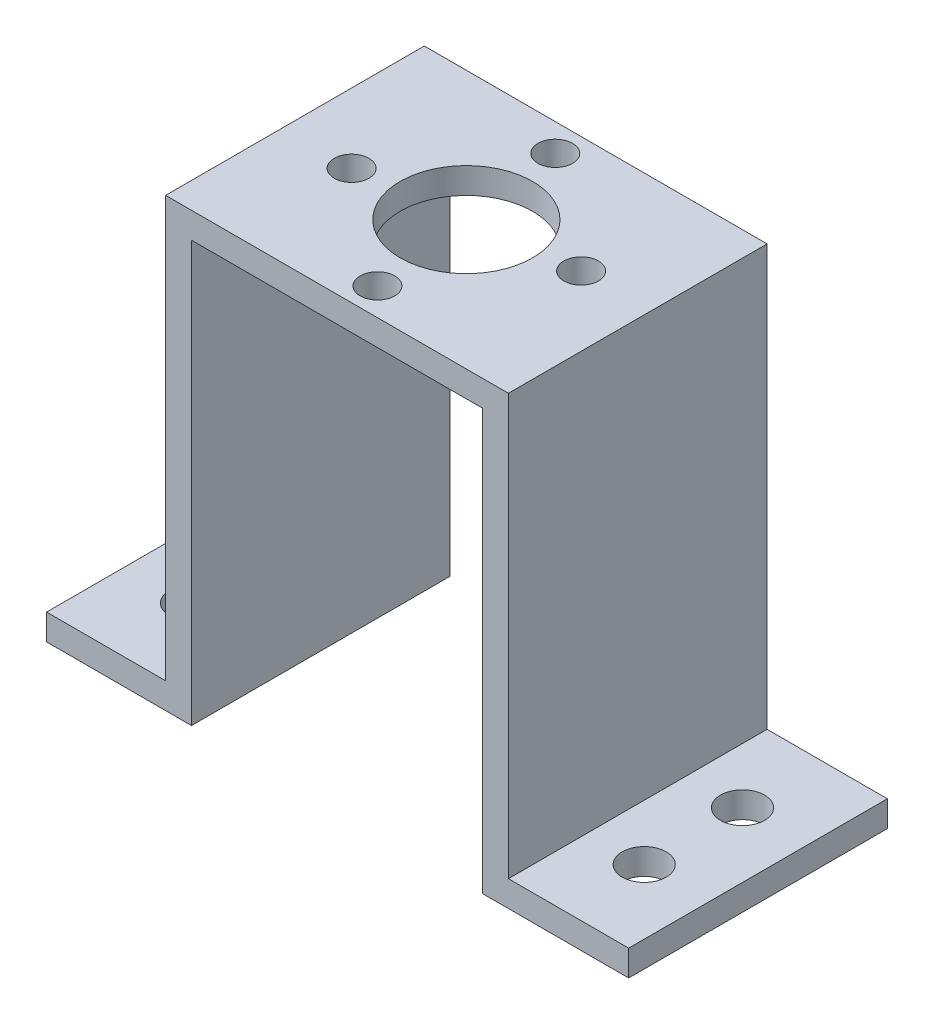
ISO-10303-21;
HEADER;
FILE_DESCRIPTION(('STEP AP214'),'2;1');
FILE_NAME('part.step','',(''),(''),'','','');
FILE_SCHEMA(('AUTOMOTIVE_DESIGN { 1 0 10303 214 1 1 1 1 }'));
ENDSEC;
DATA;
#1=APPLICATION_CONTEXT('core data for automotive mechanical design processes');
#2=APPLICATION_PROTOCOL_DEFINITION('international standard','automotive_design',2000,#1);
#3=PRODUCT_CONTEXT('',#1,'mechanical');
#4=PRODUCT('Part','Part','',(#3));
#5=PRODUCT_RELATED_PRODUCT_CATEGORY('part','',(#4));
#6=PRODUCT_DEFINITION_FORMATION('','',#4);
#7=PRODUCT_DEFINITION_CONTEXT('part definition',#1,'design');
#8=PRODUCT_DEFINITION('design','',#6,#7);
#9=PRODUCT_DEFINITION_SHAPE('','',#8);
#10=(LENGTH_UNIT() NAMED_UNIT(*) SI_UNIT(.MILLI.,.METRE.));
#11=(NAMED_UNIT(*) PLANE_ANGLE_UNIT() SI_UNIT($,.RADIAN.));
#12=(NAMED_UNIT(*) SI_UNIT($,.STERADIAN.) SOLID_ANGLE_UNIT());
#13=UNCERTAINTY_MEASURE_WITH_UNIT(LENGTH_MEASURE(1.E-05),#10,'distance_accuracy_value','');
#14=(GEOMETRIC_REPRESENTATION_CONTEXT(3) GLOBAL_UNCERTAINTY_ASSIGNED_CONTEXT((#13)) GLOBAL_UNIT_ASSIGNED_CONTEXT((#10,
#11,#12)) REPRESENTATION_CONTEXT('',''));
#15=CARTESIAN_POINT('',(0.,0.,0.));
#16=DIRECTION('',(0.,0.,1.));
#17=DIRECTION('',(1.,0.,0.));
#18=AXIS2_PLACEMENT_3D('',#15,#16,#17);
#19=CARTESIAN_POINT('',(39.116,2.54,17.526));
#20=DIRECTION('',(0.,-1.,0.));
#21=DIRECTION('',(0.,0.,-1.));
#22=AXIS2_PLACEMENT_3D('',#19,#20,#21);
#23=CYLINDRICAL_SURFACE('',#22,2.159);
#24=CARTESIAN_POINT('',(39.116,2.54,17.526));
#25=DIRECTION('',(0.,-1.,0.));
#26=DIRECTION('',(0.,0.,-1.));
#27=AXIS2_PLACEMENT_3D('',#24,#25,#26);
#28=CIRCLE('',#27,2.159);
#29=CARTESIAN_POINT('',(39.116,2.54,15.367));
#30=VERTEX_POINT('',#29);
#31=EDGE_CURVE('E158',#30,#30,#28,.T.);
#32=ORIENTED_EDGE('',*,*,#31,.F.);
#33=EDGE_LOOP('',(#32));
#34=FACE_BOUND('',#33,.T.);
#35=CARTESIAN_POINT('',(39.116,0.,17.526));
#36=DIRECTION('',(0.,-1.,0.));
#37=DIRECTION('',(0.,0.,-1.));
#38=AXIS2_PLACEMENT_3D('',#35,#36,#37);
#39=CIRCLE('',#38,2.159);
#40=CARTESIAN_POINT('',(39.116,0.,15.367));
#41=VERTEX_POINT('',#40);
#42=EDGE_CURVE('E19',#41,#41,#39,.F.);
#43=ORIENTED_EDGE('',*,*,#42,.F.);
#44=EDGE_LOOP('',(#43));
#45=FACE_BOUND('',#44,.T.);
#46=ADVANCED_FACE('F16',(#34,#45),#23,.F.);
#47=CARTESIAN_POINT('',(39.116,2.54,7.874));
#48=DIRECTION('',(0.,-1.,0.));
#49=DIRECTION('',(0.,0.,-1.));
#50=AXIS2_PLACEMENT_3D('',#47,#48,#49);
#51=CYLINDRICAL_SURFACE('',#50,2.159);
#52=CARTESIAN_POINT('',(39.116,2.54,7.874));
#53=DIRECTION('',(0.,-1.,0.));
#54=DIRECTION('',(0.,0.,-1.));
#55=AXIS2_PLACEMENT_3D('',#52,#53,#54);
#56=CIRCLE('',#55,2.159);
#57=CARTESIAN_POINT('',(39.116,2.54,5.715));
#58=VERTEX_POINT('',#57);
#59=EDGE_CURVE('E154',#58,#58,#56,.T.);
#60=ORIENTED_EDGE('',*,*,#59,.F.);
#61=EDGE_LOOP('',(#60));
#62=FACE_BOUND('',#61,.T.);
#63=CARTESIAN_POINT('',(39.116,0.,7.874));
#64=DIRECTION('',(0.,-1.,0.));
#65=DIRECTION('',(0.,0.,-1.));
#66=AXIS2_PLACEMENT_3D('',#63,#64,#65);
#67=CIRCLE('',#66,2.159);
#68=CARTESIAN_POINT('',(39.116,0.,5.715));
#69=VERTEX_POINT('',#68);
#70=EDGE_CURVE('E162',#69,#69,#67,.F.);
#71=ORIENTED_EDGE('',*,*,#70,.F.);
#72=EDGE_LOOP('',(#71));
#73=FACE_BOUND('',#72,.T.);
#74=ADVANCED_FACE('F211',(#62,#73),#51,.F.);
#75=CARTESIAN_POINT('',(16.8275,43.815,12.7));
#76=DIRECTION('',(0.,1.,0.));
#77=DIRECTION('',(0.,0.,1.));
#78=AXIS2_PLACEMENT_3D('',#75,#76,#77);
#79=CYLINDRICAL_SURFACE('',#78,6.5024);
#80=CARTESIAN_POINT('',(16.8275,43.815,12.7));
#81=DIRECTION('',(0.,1.,0.));
#82=DIRECTION('',(0.,0.,1.));
#83=AXIS2_PLACEMENT_3D('',#80,#81,#82);
#84=CIRCLE('',#83,6.5024);
#85=CARTESIAN_POINT('',(16.8275,43.815,19.2024));
#86=VERTEX_POINT('',#85);
#87=EDGE_CURVE('E150',#86,#86,#84,.F.);
#88=ORIENTED_EDGE('',*,*,#87,.F.);
#89=EDGE_LOOP('',(#88));
#90=FACE_BOUND('',#89,.T.);
#91=CARTESIAN_POINT('',(16.8275,41.275,12.7));
#92=DIRECTION('',(0.,1.,0.));
#93=DIRECTION('',(0.,0.,1.));
#94=AXIS2_PLACEMENT_3D('',#91,#92,#93);
#95=CIRCLE('',#94,6.5024);
#96=CARTESIAN_POINT('',(16.8275,41.275,19.2024));
#97=VERTEX_POINT('',#96);
#98=EDGE_CURVE('E115',#97,#97,#95,.T.);
#99=ORIENTED_EDGE('',*,*,#98,.F.);
#100=EDGE_LOOP('',(#99));
#101=FACE_BOUND('',#100,.T.);
#102=ADVANCED_FACE('F217',(#90,#101),#79,.F.);
#103=CARTESIAN_POINT('',(15.5575,43.815,2.6999946));
#104=DIRECTION('',(0.,-1.,0.));
#105=DIRECTION('',(0.,0.,-1.));
#106=AXIS2_PLACEMENT_3D('',#103,#104,#105);
#107=CYLINDRICAL_SURFACE('',#106,1.7018);
#108=CARTESIAN_POINT('',(15.5575,43.815,2.6999946));
#109=DIRECTION('',(0.,-1.,0.));
#110=DIRECTION('',(0.,0.,-1.));
#111=AXIS2_PLACEMENT_3D('',#108,#109,#110);
#112=CIRCLE('',#111,1.7018);
#113=CARTESIAN_POINT('',(15.5575,43.815,0.9981946));
#114=VERTEX_POINT('',#113);
#115=EDGE_CURVE('E193',#114,#114,#112,.T.);
#116=ORIENTED_EDGE('',*,*,#115,.F.);
#117=EDGE_LOOP('',(#116));
#118=FACE_BOUND('',#117,.T.);
#119=CARTESIAN_POINT('',(15.5575,41.275,2.6999946));
#120=DIRECTION('',(0.,-1.,0.));
#121=DIRECTION('',(0.,0.,-1.));
#122=AXIS2_PLACEMENT_3D('',#119,#120,#121);
#123=CIRCLE('',#122,1.7018);
#124=CARTESIAN_POINT('',(15.5575,41.275,0.9981946));
#125=VERTEX_POINT('',#124);
#126=EDGE_CURVE('E176',#125,#125,#123,.F.);
#127=ORIENTED_EDGE('',*,*,#126,.F.);
#128=EDGE_LOOP('',(#127));
#129=FACE_BOUND('',#128,.T.);
#130=ADVANCED_FACE('F292',(#118,#129),#107,.F.);
#131=CARTESIAN_POINT('',(6.8274946,43.815,13.97));
#132=DIRECTION('',(0.,-1.,0.));
#133=DIRECTION('',(0.,0.,-1.));
#134=AXIS2_PLACEMENT_3D('',#131,#132,#133);
#135=CYLINDRICAL_SURFACE('',#134,1.7018);
#136=CARTESIAN_POINT('',(6.8274946,43.815,13.97));
#137=DIRECTION('',(0.,-1.,0.));
#138=DIRECTION('',(0.,0.,-1.));
#139=AXIS2_PLACEMENT_3D('',#136,#137,#138);
#140=CIRCLE('',#139,1.7018);
#141=CARTESIAN_POINT('',(6.8274946,43.815,12.2682));
#142=VERTEX_POINT('',#141);
#143=EDGE_CURVE('E190',#142,#142,#140,.T.);
#144=ORIENTED_EDGE('',*,*,#143,.F.);
#145=EDGE_LOOP('',(#144));
#146=FACE_BOUND('',#145,.T.);
#147=CARTESIAN_POINT('',(6.8274946,41.275,13.97));
#148=DIRECTION('',(0.,-1.,0.));
#149=DIRECTION('',(0.,0.,-1.));
#150=AXIS2_PLACEMENT_3D('',#147,#148,#149);
#151=CIRCLE('',#150,1.7018);
#152=CARTESIAN_POINT('',(6.8274946,41.275,12.2682));
#153=VERTEX_POINT('',#152);
#154=EDGE_CURVE('E173',#153,#153,#151,.F.);
#155=ORIENTED_EDGE('',*,*,#154,.F.);
#156=EDGE_LOOP('',(#155));
#157=FACE_BOUND('',#156,.T.);
#158=ADVANCED_FACE('F288',(#146,#157),#135,.F.);
#159=CARTESIAN_POINT('',(18.0975,43.815,22.7000054));
#160=DIRECTION('',(0.,-1.,0.));
#161=DIRECTION('',(0.,0.,-1.));
#162=AXIS2_PLACEMENT_3D('',#159,#160,#161);
#163=CYLINDRICAL_SURFACE('',#162,1.7018);
#164=CARTESIAN_POINT('',(18.0975,43.815,22.7000054));
#165=DIRECTION('',(0.,-1.,0.));
#166=DIRECTION('',(0.,0.,-1.));
#167=AXIS2_PLACEMENT_3D('',#164,#165,#166);
#168=CIRCLE('',#167,1.7018);
#169=CARTESIAN_POINT('',(18.0975,43.815,20.9982054));
#170=VERTEX_POINT('',#169);
#171=EDGE_CURVE('E187',#170,#170,#168,.T.);
#172=ORIENTED_EDGE('',*,*,#171,.F.);
#173=EDGE_LOOP('',(#172));
#174=FACE_BOUND('',#173,.T.);
#175=CARTESIAN_POINT('',(18.0975,41.275,22.7000054));
#176=DIRECTION('',(0.,-1.,0.));
#177=DIRECTION('',(0.,0.,-1.));
#178=AXIS2_PLACEMENT_3D('',#175,#176,#177);
#179=CIRCLE('',#178,1.7018);
#180=CARTESIAN_POINT('',(18.0975,41.275,20.9982054));
#181=VERTEX_POINT('',#180);
#182=EDGE_CURVE('E132',#181,#181,#179,.F.);
#183=ORIENTED_EDGE('',*,*,#182,.F.);
#184=EDGE_LOOP('',(#183));
#185=FACE_BOUND('',#184,.T.);
#186=ADVANCED_FACE('F284',(#174,#185),#163,.F.);
#187=CARTESIAN_POINT('',(26.8275054,43.815,11.43));
#188=DIRECTION('',(0.,-1.,0.));
#189=DIRECTION('',(0.,0.,-1.));
#190=AXIS2_PLACEMENT_3D('',#187,#188,#189);
#191=CYLINDRICAL_SURFACE('',#190,1.7018);
#192=CARTESIAN_POINT('',(26.8275054,43.815,11.43));
#193=DIRECTION('',(0.,-1.,0.));
#194=DIRECTION('',(0.,0.,-1.));
#195=AXIS2_PLACEMENT_3D('',#192,#193,#194);
#196=CIRCLE('',#195,1.7018);
#197=CARTESIAN_POINT('',(26.8275054,43.815,9.72820000000001));
#198=VERTEX_POINT('',#197);
#199=EDGE_CURVE('E146',#198,#198,#196,.T.);
#200=ORIENTED_EDGE('',*,*,#199,.F.);
#201=EDGE_LOOP('',(#200));
#202=FACE_BOUND('',#201,.T.);
#203=CARTESIAN_POINT('',(26.8275054,41.275,11.43));
#204=DIRECTION('',(0.,-1.,0.));
#205=DIRECTION('',(0.,0.,-1.));
#206=AXIS2_PLACEMENT_3D('',#203,#204,#205);
#207=CIRCLE('',#206,1.7018);
#208=CARTESIAN_POINT('',(26.8275054,41.275,9.72820000000001));
#209=VERTEX_POINT('',#208);
#210=EDGE_CURVE('E129',#209,#209,#207,.F.);
#211=ORIENTED_EDGE('',*,*,#210,.F.);
#212=EDGE_LOOP('',(#211));
#213=FACE_BOUND('',#212,.T.);
#214=ADVANCED_FACE('F280',(#202,#213),#191,.F.);
#215=CARTESIAN_POINT('',(-5.33399999999999,2.54,17.526));
#216=DIRECTION('',(0.,-1.,0.));
#217=DIRECTION('',(0.,0.,-1.));
#218=AXIS2_PLACEMENT_3D('',#215,#216,#217);
#219=CYLINDRICAL_SURFACE('',#218,2.159);
#220=CARTESIAN_POINT('',(-5.33399999999999,2.54,17.526));
#221=DIRECTION('',(0.,-1.,0.));
#222=DIRECTION('',(0.,0.,-1.));
#223=AXIS2_PLACEMENT_3D('',#220,#221,#222);
#224=CIRCLE('',#223,2.159);
#225=CARTESIAN_POINT('',(-5.33399999999999,2.54,15.367));
#226=VERTEX_POINT('',#225);
#227=EDGE_CURVE('E142',#226,#226,#224,.T.);
#228=ORIENTED_EDGE('',*,*,#227,.F.);
#229=EDGE_LOOP('',(#228));
#230=FACE_BOUND('',#229,.T.);
#231=CARTESIAN_POINT('',(-5.33399999999999,0.,17.526));
#232=DIRECTION('',(0.,-1.,0.));
#233=DIRECTION('',(0.,0.,-1.));
#234=AXIS2_PLACEMENT_3D('',#231,#232,#233);
#235=CIRCLE('',#234,2.159);
#236=CARTESIAN_POINT('',(-5.33399999999999,0.,15.367));
#237=VERTEX_POINT('',#236);
#238=EDGE_CURVE('E167',#237,#237,#235,.F.);
#239=ORIENTED_EDGE('',*,*,#238,.F.);
#240=EDGE_LOOP('',(#239));
#241=FACE_BOUND('',#240,.T.);
#242=ADVANCED_FACE('F276',(#230,#241),#219,.F.);
#243=CARTESIAN_POINT('',(-5.33399999999999,2.54,7.874));
#244=DIRECTION('',(0.,-1.,0.));
#245=DIRECTION('',(0.,0.,-1.));
#246=AXIS2_PLACEMENT_3D('',#243,#244,#245);
#247=CYLINDRICAL_SURFACE('',#246,2.159);
#248=CARTESIAN_POINT('',(-5.33399999999999,2.54,7.874));
#249=DIRECTION('',(0.,-1.,0.));
#250=DIRECTION('',(0.,0.,-1.));
#251=AXIS2_PLACEMENT_3D('',#248,#249,#250);
#252=CIRCLE('',#251,2.159);
#253=CARTESIAN_POINT('',(-5.33399999999999,2.54,5.715));
#254=VERTEX_POINT('',#253);
#255=EDGE_CURVE('E138',#254,#254,#252,.T.);
#256=ORIENTED_EDGE('',*,*,#255,.F.);
#257=EDGE_LOOP('',(#256));
#258=FACE_BOUND('',#257,.T.);
#259=CARTESIAN_POINT('',(-5.33399999999999,0.,7.874));
#260=DIRECTION('',(0.,-1.,0.));
#261=DIRECTION('',(0.,0.,-1.));
#262=AXIS2_PLACEMENT_3D('',#259,#260,#261);
#263=CIRCLE('',#262,2.159);
#264=CARTESIAN_POINT('',(-5.33399999999999,0.,5.715));
#265=VERTEX_POINT('',#264);
#266=EDGE_CURVE('E164',#265,#265,#263,.F.);
#267=ORIENTED_EDGE('',*,*,#266,.F.);
#268=EDGE_LOOP('',(#267));
#269=FACE_BOUND('',#268,.T.);
#270=ADVANCED_FACE('F273',(#258,#269),#247,.F.);
#271=CARTESIAN_POINT('',(31.115,41.275,0.));
#272=DIRECTION('',(-1.,0.,0.));
#273=DIRECTION('',(0.,0.,1.));
#274=AXIS2_PLACEMENT_3D('',#271,#272,#273);
#275=PLANE('',#274);
#276=DIRECTION('',(0.,0.,-1.));
#277=VECTOR('',#276,1.);
#278=CARTESIAN_POINT('',(31.115,41.275,0.));
#279=LINE('',#278,#277);
#280=CARTESIAN_POINT('',(31.115,41.275,0.));
#281=VERTEX_POINT('',#280);
#282=CARTESIAN_POINT('',(31.115,41.275,25.4));
#283=VERTEX_POINT('',#282);
#284=EDGE_CURVE('E107',#281,#283,#279,.F.);
#285=ORIENTED_EDGE('',*,*,#284,.F.);
#286=DIRECTION('',(0.,1.,0.));
#287=VECTOR('',#286,1.);
#288=CARTESIAN_POINT('',(31.115,0.,0.));
#289=LINE('',#288,#287);
#290=CARTESIAN_POINT('',(31.115,0.,0.));
#291=VERTEX_POINT('',#290);
#292=EDGE_CURVE('E332',#281,#291,#289,.F.);
#293=ORIENTED_EDGE('',*,*,#292,.T.);
#294=DIRECTION('',(0.,0.,-1.));
#295=VECTOR('',#294,1.);
#296=CARTESIAN_POINT('',(31.115,0.,0.));
#297=LINE('',#296,#295);
#298=CARTESIAN_POINT('',(31.115,0.,25.4));
#299=VERTEX_POINT('',#298);
#300=EDGE_CURVE('E102',#299,#291,#297,.T.);
#301=ORIENTED_EDGE('',*,*,#300,.F.);
#302=DIRECTION('',(0.,1.,0.));
#303=VECTOR('',#302,1.);
#304=CARTESIAN_POINT('',(31.115,0.,25.4));
#305=LINE('',#304,#303);
#306=EDGE_CURVE('E119',#283,#299,#305,.F.);
#307=ORIENTED_EDGE('',*,*,#306,.F.);
#308=EDGE_LOOP('',(#285,#293,#301,#307));
#309=FACE_BOUND('',#308,.T.);
#310=ADVANCED_FACE('F120',(#309),#275,.T.);
#311=CARTESIAN_POINT('',(31.115,0.,0.));
#312=DIRECTION('',(0.,-1.,0.));
#313=DIRECTION('',(0.,0.,-1.));
#314=AXIS2_PLACEMENT_3D('',#311,#312,#313);
#315=PLANE('',#314);
#316=ORIENTED_EDGE('',*,*,#70,.T.);
#317=EDGE_LOOP('',(#316));
#318=FACE_BOUND('',#317,.T.);
#319=ORIENTED_EDGE('',*,*,#42,.T.);
#320=EDGE_LOOP('',(#319));
#321=FACE_BOUND('',#320,.T.);
#322=DIRECTION('',(0.,0.,-1.));
#323=VECTOR('',#322,1.);
#324=CARTESIAN_POINT('',(45.466,0.,0.));
#325=LINE('',#324,#323);
#326=CARTESIAN_POINT('',(45.466,0.,25.4));
#327=VERTEX_POINT('',#326);
#328=CARTESIAN_POINT('',(45.466,0.,0.));
#329=VERTEX_POINT('',#328);
#330=EDGE_CURVE('E159',#327,#329,#325,.T.);
#331=ORIENTED_EDGE('',*,*,#330,.F.);
#332=DIRECTION('',(1.,0.,0.));
#333=VECTOR('',#332,1.);
#334=CARTESIAN_POINT('',(0.,0.,25.4));
#335=LINE('',#334,#333);
#336=EDGE_CURVE('E123',#299,#327,#335,.T.);
#337=ORIENTED_EDGE('',*,*,#336,.F.);
#338=ORIENTED_EDGE('',*,*,#300,.T.);
#339=DIRECTION('',(1.,0.,0.));
#340=VECTOR('',#339,1.);
#341=CARTESIAN_POINT('',(0.,0.,0.));
#342=LINE('',#341,#340);
#343=EDGE_CURVE('E330',#291,#329,#342,.T.);
#344=ORIENTED_EDGE('',*,*,#343,.T.);
#345=EDGE_LOOP('',(#331,#337,#338,#344));
#346=FACE_BOUND('',#345,.T.);
#347=ADVANCED_FACE('F207',(#318,#321,#346),#315,.T.);
#348=CARTESIAN_POINT('',(45.466,0.,0.));
#349=DIRECTION('',(1.,0.,0.));
#350=DIRECTION('',(0.,0.,-1.));
#351=AXIS2_PLACEMENT_3D('',#348,#349,#350);
#352=PLANE('',#351);
#353=ORIENTED_EDGE('',*,*,#330,.T.);
#354=DIRECTION('',(0.,1.,0.));
#355=VECTOR('',#354,1.);
#356=CARTESIAN_POINT('',(45.466,0.,0.));
#357=LINE('',#356,#355);
#358=CARTESIAN_POINT('',(45.466,2.54,0.));
#359=VERTEX_POINT('',#358);
#360=EDGE_CURVE('E328',#329,#359,#357,.T.);
#361=ORIENTED_EDGE('',*,*,#360,.T.);
#362=DIRECTION('',(0.,0.,1.));
#363=VECTOR('',#362,1.);
#364=CARTESIAN_POINT('',(45.466,2.54,0.));
#365=LINE('',#364,#363);
#366=CARTESIAN_POINT('',(45.466,2.54,25.4));
#367=VERTEX_POINT('',#366);
#368=EDGE_CURVE('E155',#367,#359,#365,.F.);
#369=ORIENTED_EDGE('',*,*,#368,.F.);
#370=DIRECTION('',(0.,1.,0.));
#371=VECTOR('',#370,1.);
#372=CARTESIAN_POINT('',(45.466,0.,25.4));
#373=LINE('',#372,#371);
#374=EDGE_CURVE('E354',#327,#367,#373,.T.);
#375=ORIENTED_EDGE('',*,*,#374,.F.);
#376=EDGE_LOOP('',(#353,#361,#369,#375));
#377=FACE_BOUND('',#376,.T.);
#378=ADVANCED_FACE('F264',(#377),#352,.T.);
#379=CARTESIAN_POINT('',(45.466,2.54,0.));
#380=DIRECTION('',(0.,1.,0.));
#381=DIRECTION('',(0.,0.,1.));
#382=AXIS2_PLACEMENT_3D('',#379,#380,#381);
#383=PLANE('',#382);
#384=ORIENTED_EDGE('',*,*,#59,.T.);
#385=EDGE_LOOP('',(#384));
#386=FACE_BOUND('',#385,.T.);
#387=ORIENTED_EDGE('',*,*,#31,.T.);
#388=EDGE_LOOP('',(#387));
#389=FACE_BOUND('',#388,.T.);
#390=ORIENTED_EDGE('',*,*,#368,.T.);
#391=DIRECTION('',(1.,0.,0.));
#392=VECTOR('',#391,1.);
#393=CARTESIAN_POINT('',(0.,2.54,0.));
#394=LINE('',#393,#392);
#395=CARTESIAN_POINT('',(33.655,2.54,0.));
#396=VERTEX_POINT('',#395);
#397=EDGE_CURVE('E323',#359,#396,#394,.F.);
#398=ORIENTED_EDGE('',*,*,#397,.T.);
#399=DIRECTION('',(0.,0.,-1.));
#400=VECTOR('',#399,1.);
#401=CARTESIAN_POINT('',(33.655,2.54,0.));
#402=LINE('',#401,#400);
#403=CARTESIAN_POINT('',(33.655,2.54,25.4));
#404=VERTEX_POINT('',#403);
#405=EDGE_CURVE('E151',#404,#396,#402,.T.);
#406=ORIENTED_EDGE('',*,*,#405,.F.);
#407=DIRECTION('',(1.,0.,0.));
#408=VECTOR('',#407,1.);
#409=CARTESIAN_POINT('',(0.,2.54,25.4));
#410=LINE('',#409,#408);
#411=EDGE_CURVE('E351',#367,#404,#410,.F.);
#412=ORIENTED_EDGE('',*,*,#411,.F.);
#413=EDGE_LOOP('',(#390,#398,#406,#412));
#414=FACE_BOUND('',#413,.T.);
#415=ADVANCED_FACE('F260',(#386,#389,#414),#383,.T.);
#416=CARTESIAN_POINT('',(33.655,2.54,0.));
#417=DIRECTION('',(1.,0.,0.));
#418=DIRECTION('',(0.,0.,-1.));
#419=AXIS2_PLACEMENT_3D('',#416,#417,#418);
#420=PLANE('',#419);
#421=ORIENTED_EDGE('',*,*,#405,.T.);
#422=DIRECTION('',(0.,1.,0.));
#423=VECTOR('',#422,1.);
#424=CARTESIAN_POINT('',(33.655,0.,0.));
#425=LINE('',#424,#423);
#426=CARTESIAN_POINT('',(33.655,43.815,0.));
#427=VERTEX_POINT('',#426);
#428=EDGE_CURVE('E318',#396,#427,#425,.T.);
#429=ORIENTED_EDGE('',*,*,#428,.T.);
#430=DIRECTION('',(0.,0.,1.));
#431=VECTOR('',#430,1.);
#432=CARTESIAN_POINT('',(33.655,43.815,0.));
#433=LINE('',#432,#431);
#434=CARTESIAN_POINT('',(33.655,43.815,25.4));
#435=VERTEX_POINT('',#434);
#436=EDGE_CURVE('E147',#435,#427,#433,.F.);
#437=ORIENTED_EDGE('',*,*,#436,.F.);
#438=DIRECTION('',(0.,1.,0.));
#439=VECTOR('',#438,1.);
#440=CARTESIAN_POINT('',(33.655,0.,25.4));
#441=LINE('',#440,#439);
#442=EDGE_CURVE('E349',#404,#435,#441,.T.);
#443=ORIENTED_EDGE('',*,*,#442,.F.);
#444=EDGE_LOOP('',(#421,#429,#437,#443));
#445=FACE_BOUND('',#444,.T.);
#446=ADVANCED_FACE('F256',(#445),#420,.T.);
#447=CARTESIAN_POINT('',(33.655,43.815,0.));
#448=DIRECTION('',(0.,1.,0.));
#449=DIRECTION('',(0.,0.,1.));
#450=AXIS2_PLACEMENT_3D('',#447,#448,#449);
#451=PLANE('',#450);
#452=ORIENTED_EDGE('',*,*,#199,.T.);
#453=EDGE_LOOP('',(#452));
#454=FACE_BOUND('',#453,.T.);
#455=ORIENTED_EDGE('',*,*,#171,.T.);
#456=EDGE_LOOP('',(#455));
#457=FACE_BOUND('',#456,.T.);
#458=ORIENTED_EDGE('',*,*,#143,.T.);
#459=EDGE_LOOP('',(#458));
#460=FACE_BOUND('',#459,.T.);
#461=ORIENTED_EDGE('',*,*,#115,.T.);
#462=EDGE_LOOP('',(#461));
#463=FACE_BOUND('',#462,.T.);
#464=ORIENTED_EDGE('',*,*,#87,.T.);
#465=EDGE_LOOP('',(#464));
#466=FACE_BOUND('',#465,.T.);
#467=ORIENTED_EDGE('',*,*,#436,.T.);
#468=DIRECTION('',(1.,0.,0.));
#469=VECTOR('',#468,1.);
#470=CARTESIAN_POINT('',(0.,43.815,0.));
#471=LINE('',#470,#469);
#472=CARTESIAN_POINT('',(0.,43.815,0.));
#473=VERTEX_POINT('',#472);
#474=EDGE_CURVE('E309',#427,#473,#471,.F.);
#475=ORIENTED_EDGE('',*,*,#474,.T.);
#476=DIRECTION('',(0.,0.,1.));
#477=VECTOR('',#476,1.);
#478=CARTESIAN_POINT('',(0.,43.815,0.));
#479=LINE('',#478,#477);
#480=CARTESIAN_POINT('',(0.,43.815,25.4));
#481=VERTEX_POINT('',#480);
#482=EDGE_CURVE('E143',#481,#473,#479,.F.);
#483=ORIENTED_EDGE('',*,*,#482,.F.);
#484=DIRECTION('',(1.,0.,0.));
#485=VECTOR('',#484,1.);
#486=CARTESIAN_POINT('',(0.,43.815,25.4));
#487=LINE('',#486,#485);
#488=EDGE_CURVE('E311',#435,#481,#487,.F.);
#489=ORIENTED_EDGE('',*,*,#488,.F.);
#490=EDGE_LOOP('',(#467,#475,#483,#489));
#491=FACE_BOUND('',#490,.T.);
#492=ADVANCED_FACE('F252',(#454,#457,#460,#463,#466,#491),#451,.T.);
#493=CARTESIAN_POINT('',(0.,43.815,0.));
#494=DIRECTION('',(-1.,0.,0.));
#495=DIRECTION('',(0.,0.,1.));
#496=AXIS2_PLACEMENT_3D('',#493,#494,#495);
#497=PLANE('',#496);
#498=ORIENTED_EDGE('',*,*,#482,.T.);
#499=DIRECTION('',(0.,1.,0.));
#500=VECTOR('',#499,1.);
#501=CARTESIAN_POINT('',(0.,0.,0.));
#502=LINE('',#501,#500);
#503=CARTESIAN_POINT('',(0.,2.54,0.));
#504=VERTEX_POINT('',#503);
#505=EDGE_CURVE('E319',#473,#504,#502,.F.);
#506=ORIENTED_EDGE('',*,*,#505,.T.);
#507=DIRECTION('',(0.,0.,1.));
#508=VECTOR('',#507,1.);
#509=CARTESIAN_POINT('',(0.,2.54,0.));
#510=LINE('',#509,#508);
#511=CARTESIAN_POINT('',(0.,2.54,25.4));
#512=VERTEX_POINT('',#511);
#513=EDGE_CURVE('E139',#512,#504,#510,.F.);
#514=ORIENTED_EDGE('',*,*,#513,.F.);
#515=DIRECTION('',(0.,1.,0.));
#516=VECTOR('',#515,1.);
#517=CARTESIAN_POINT('',(0.,0.,25.4));
#518=LINE('',#517,#516);
#519=EDGE_CURVE('E345',#481,#512,#518,.F.);
#520=ORIENTED_EDGE('',*,*,#519,.F.);
#521=EDGE_LOOP('',(#498,#506,#514,#520));
#522=FACE_BOUND('',#521,.T.);
#523=ADVANCED_FACE('F248',(#522),#497,.T.);
#524=CARTESIAN_POINT('',(0.,2.54,0.));
#525=DIRECTION('',(0.,1.,0.));
#526=DIRECTION('',(0.,0.,1.));
#527=AXIS2_PLACEMENT_3D('',#524,#525,#526);
#528=PLANE('',#527);
#529=ORIENTED_EDGE('',*,*,#255,.T.);
#530=EDGE_LOOP('',(#529));
#531=FACE_BOUND('',#530,.T.);
#532=ORIENTED_EDGE('',*,*,#227,.T.);
#533=EDGE_LOOP('',(#532));
#534=FACE_BOUND('',#533,.T.);
#535=ORIENTED_EDGE('',*,*,#513,.T.);
#536=DIRECTION('',(1.,0.,0.));
#537=VECTOR('',#536,1.);
#538=CARTESIAN_POINT('',(0.,2.54,0.));
#539=LINE('',#538,#537);
#540=CARTESIAN_POINT('',(-11.684,2.54,0.));
#541=VERTEX_POINT('',#540);
#542=EDGE_CURVE('E321',#504,#541,#539,.F.);
#543=ORIENTED_EDGE('',*,*,#542,.T.);
#544=DIRECTION('',(0.,0.,1.));
#545=VECTOR('',#544,1.);
#546=CARTESIAN_POINT('',(-11.684,2.54,0.));
#547=LINE('',#546,#545);
#548=CARTESIAN_POINT('',(-11.684,2.54,25.4));
#549=VERTEX_POINT('',#548);
#550=EDGE_CURVE('E116',#549,#541,#547,.F.);
#551=ORIENTED_EDGE('',*,*,#550,.F.);
#552=DIRECTION('',(1.,0.,0.));
#553=VECTOR('',#552,1.);
#554=CARTESIAN_POINT('',(0.,2.54,25.4));
#555=LINE('',#554,#553);
#556=EDGE_CURVE('E342',#512,#549,#555,.F.);
#557=ORIENTED_EDGE('',*,*,#556,.F.);
#558=EDGE_LOOP('',(#535,#543,#551,#557));
#559=FACE_BOUND('',#558,.T.);
#560=ADVANCED_FACE('F244',(#531,#534,#559),#528,.T.);
#561=CARTESIAN_POINT('',(-11.684,2.54,0.));
#562=DIRECTION('',(-1.,0.,0.));
#563=DIRECTION('',(0.,0.,1.));
#564=AXIS2_PLACEMENT_3D('',#561,#562,#563);
#565=PLANE('',#564);
#566=ORIENTED_EDGE('',*,*,#550,.T.);
#567=DIRECTION('',(0.,1.,0.));
#568=VECTOR('',#567,1.);
#569=CARTESIAN_POINT('',(-11.684,0.,0.));
#570=LINE('',#569,#568);
#571=CARTESIAN_POINT('',(-11.684,0.,0.));
#572=VERTEX_POINT('',#571);
#573=EDGE_CURVE('E371',#541,#572,#570,.F.);
#574=ORIENTED_EDGE('',*,*,#573,.T.);
#575=DIRECTION('',(0.,0.,-1.));
#576=VECTOR('',#575,1.);
#577=CARTESIAN_POINT('',(-11.684,0.,0.));
#578=LINE('',#577,#576);
#579=CARTESIAN_POINT('',(-11.684,0.,25.4));
#580=VERTEX_POINT('',#579);
#581=EDGE_CURVE('E169',#580,#572,#578,.T.);
#582=ORIENTED_EDGE('',*,*,#581,.F.);
#583=DIRECTION('',(0.,1.,0.));
#584=VECTOR('',#583,1.);
#585=CARTESIAN_POINT('',(-11.684,0.,25.4));
#586=LINE('',#585,#584);
#587=EDGE_CURVE('E340',#549,#580,#586,.F.);
#588=ORIENTED_EDGE('',*,*,#587,.F.);
#589=EDGE_LOOP('',(#566,#574,#582,#588));
#590=FACE_BOUND('',#589,.T.);
#591=ADVANCED_FACE('F240',(#590),#565,.T.);
#592=CARTESIAN_POINT('',(2.54,41.275,0.));
#593=DIRECTION('',(0.,-1.,0.));
#594=DIRECTION('',(0.,0.,-1.));
#595=AXIS2_PLACEMENT_3D('',#592,#593,#594);
#596=PLANE('',#595);
#597=ORIENTED_EDGE('',*,*,#210,.T.);
#598=EDGE_LOOP('',(#597));
#599=FACE_BOUND('',#598,.T.);
#600=ORIENTED_EDGE('',*,*,#182,.T.);
#601=EDGE_LOOP('',(#600));
#602=FACE_BOUND('',#601,.T.);
#603=ORIENTED_EDGE('',*,*,#154,.T.);
#604=EDGE_LOOP('',(#603));
#605=FACE_BOUND('',#604,.T.);
#606=ORIENTED_EDGE('',*,*,#126,.T.);
#607=EDGE_LOOP('',(#606));
#608=FACE_BOUND('',#607,.T.);
#609=ORIENTED_EDGE('',*,*,#98,.T.);
#610=EDGE_LOOP('',(#609));
#611=FACE_BOUND('',#610,.T.);
#612=DIRECTION('',(0.,0.,-1.));
#613=VECTOR('',#612,1.);
#614=CARTESIAN_POINT('',(2.54,41.275,0.));
#615=LINE('',#614,#613);
#616=CARTESIAN_POINT('',(2.54,41.275,0.));
#617=VERTEX_POINT('',#616);
#618=CARTESIAN_POINT('',(2.54,41.275,25.4));
#619=VERTEX_POINT('',#618);
#620=EDGE_CURVE('E369',#617,#619,#615,.F.);
#621=ORIENTED_EDGE('',*,*,#620,.F.);
#622=DIRECTION('',(1.,0.,0.));
#623=VECTOR('',#622,1.);
#624=CARTESIAN_POINT('',(0.,41.275,0.));
#625=LINE('',#624,#623);
#626=EDGE_CURVE('E113',#617,#281,#625,.T.);
#627=ORIENTED_EDGE('',*,*,#626,.T.);
#628=ORIENTED_EDGE('',*,*,#284,.T.);
#629=DIRECTION('',(1.,0.,0.));
#630=VECTOR('',#629,1.);
#631=CARTESIAN_POINT('',(0.,41.275,25.4));
#632=LINE('',#631,#630);
#633=EDGE_CURVE('E110',#619,#283,#632,.T.);
#634=ORIENTED_EDGE('',*,*,#633,.F.);
#635=EDGE_LOOP('',(#621,#627,#628,#634));
#636=FACE_BOUND('',#635,.T.);
#637=ADVANCED_FACE('F108',(#599,#602,#605,#608,#611,#636),#596,.T.);
#638=CARTESIAN_POINT('',(0.,0.,25.4));
#639=DIRECTION('',(0.,0.,1.));
#640=DIRECTION('',(1.,0.,0.));
#641=AXIS2_PLACEMENT_3D('',#638,#639,#640);
#642=PLANE('',#641);
#643=ORIENTED_EDGE('',*,*,#587,.T.);
#644=DIRECTION('',(1.,0.,0.));
#645=VECTOR('',#644,1.);
#646=CARTESIAN_POINT('',(0.,0.,25.4));
#647=LINE('',#646,#645);
#648=CARTESIAN_POINT('',(2.54,0.,25.4));
#649=VERTEX_POINT('',#648);
#650=EDGE_CURVE('E337',#649,#580,#647,.F.);
#651=ORIENTED_EDGE('',*,*,#650,.F.);
#652=DIRECTION('',(0.,1.,0.));
#653=VECTOR('',#652,1.);
#654=CARTESIAN_POINT('',(2.54,0.,25.4));
#655=LINE('',#654,#653);
#656=EDGE_CURVE('E127',#619,#649,#655,.F.);
#657=ORIENTED_EDGE('',*,*,#656,.F.);
#658=ORIENTED_EDGE('',*,*,#633,.T.);
#659=ORIENTED_EDGE('',*,*,#306,.T.);
#660=ORIENTED_EDGE('',*,*,#336,.T.);
#661=ORIENTED_EDGE('',*,*,#374,.T.);
#662=ORIENTED_EDGE('',*,*,#411,.T.);
#663=ORIENTED_EDGE('',*,*,#442,.T.);
#664=ORIENTED_EDGE('',*,*,#488,.T.);
#665=ORIENTED_EDGE('',*,*,#519,.T.);
#666=ORIENTED_EDGE('',*,*,#556,.T.);
#667=EDGE_LOOP('',(#643,#651,#657,#658,#659,#660,#661,#662,#663,#664,#665,#666));
#668=FACE_BOUND('',#667,.T.);
#669=ADVANCED_FACE('F125',(#668),#642,.T.);
#670=CARTESIAN_POINT('',(0.,0.,0.));
#671=DIRECTION('',(0.,-1.,0.));
#672=DIRECTION('',(0.,0.,-1.));
#673=AXIS2_PLACEMENT_3D('',#670,#671,#672);
#674=PLANE('',#673);
#675=ORIENTED_EDGE('',*,*,#266,.T.);
#676=EDGE_LOOP('',(#675));
#677=FACE_BOUND('',#676,.T.);
#678=ORIENTED_EDGE('',*,*,#238,.T.);
#679=EDGE_LOOP('',(#678));
#680=FACE_BOUND('',#679,.T.);
#681=ORIENTED_EDGE('',*,*,#581,.T.);
#682=DIRECTION('',(1.,0.,0.));
#683=VECTOR('',#682,1.);
#684=CARTESIAN_POINT('',(0.,0.,0.));
#685=LINE('',#684,#683);
#686=CARTESIAN_POINT('',(2.54,0.,0.));
#687=VERTEX_POINT('',#686);
#688=EDGE_CURVE('E34',#572,#687,#685,.T.);
#689=ORIENTED_EDGE('',*,*,#688,.T.);
#690=DIRECTION('',(0.,0.,-1.));
#691=VECTOR('',#690,1.);
#692=CARTESIAN_POINT('',(2.54,0.,0.));
#693=LINE('',#692,#691);
#694=EDGE_CURVE('E25',#649,#687,#693,.T.);
#695=ORIENTED_EDGE('',*,*,#694,.F.);
#696=ORIENTED_EDGE('',*,*,#650,.T.);
#697=EDGE_LOOP('',(#681,#689,#695,#696));
#698=FACE_BOUND('',#697,.T.);
#699=ADVANCED_FACE('F228',(#677,#680,#698),#674,.T.);
#700=CARTESIAN_POINT('',(0.,0.,0.));
#701=DIRECTION('',(0.,0.,1.));
#702=DIRECTION('',(1.,0.,0.));
#703=AXIS2_PLACEMENT_3D('',#700,#701,#702);
#704=PLANE('',#703);
#705=ORIENTED_EDGE('',*,*,#542,.F.);
#706=ORIENTED_EDGE('',*,*,#505,.F.);
#707=ORIENTED_EDGE('',*,*,#474,.F.);
#708=ORIENTED_EDGE('',*,*,#428,.F.);
#709=ORIENTED_EDGE('',*,*,#397,.F.);
#710=ORIENTED_EDGE('',*,*,#360,.F.);
#711=ORIENTED_EDGE('',*,*,#343,.F.);
#712=ORIENTED_EDGE('',*,*,#292,.F.);
#713=ORIENTED_EDGE('',*,*,#626,.F.);
#714=DIRECTION('',(0.,1.,0.));
#715=VECTOR('',#714,1.);
#716=CARTESIAN_POINT('',(2.54,0.,0.));
#717=LINE('',#716,#715);
#718=EDGE_CURVE('E11',#687,#617,#717,.T.);
#719=ORIENTED_EDGE('',*,*,#718,.F.);
#720=ORIENTED_EDGE('',*,*,#688,.F.);
#721=ORIENTED_EDGE('',*,*,#573,.F.);
#722=EDGE_LOOP('',(#705,#706,#707,#708,#709,#710,#711,#712,#713,#719,#720,#721));
#723=FACE_BOUND('',#722,.T.);
#724=ADVANCED_FACE('F222',(#723),#704,.F.);
#725=CARTESIAN_POINT('',(2.54,0.,0.));
#726=DIRECTION('',(1.,0.,0.));
#727=DIRECTION('',(0.,0.,-1.));
#728=AXIS2_PLACEMENT_3D('',#725,#726,#727);
#729=PLANE('',#728);
#730=ORIENTED_EDGE('',*,*,#694,.T.);
#731=ORIENTED_EDGE('',*,*,#718,.T.);
#732=ORIENTED_EDGE('',*,*,#620,.T.);
#733=ORIENTED_EDGE('',*,*,#656,.T.);
#734=EDGE_LOOP('',(#730,#731,#732,#733));
#735=FACE_BOUND('',#734,.T.);
#736=ADVANCED_FACE('F220',(#735),#729,.T.);
#737=CLOSED_SHELL('',(#46,#74,#102,#130,#158,#186,#214,#242,#270,#310,#347,#378,#415,#446,#492,
#523,#560,#591,#637,#669,#699,#724,#736));
#738=MANIFOLD_SOLID_BREP('B1',#737);
#739=ADVANCED_BREP_SHAPE_REPRESENTATION('',(#18,#738),#14);
#740=SHAPE_DEFINITION_REPRESENTATION(#9,#739);
ENDSEC;
END-ISO-10303-21;
